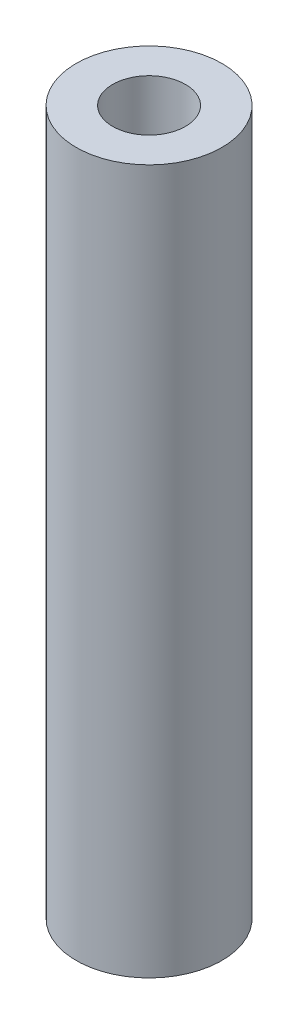
ISO-10303-21;
HEADER;
FILE_DESCRIPTION(('STEP AP214'),'2;1');
FILE_NAME('part.step','',(''),(''),'','','');
FILE_SCHEMA(('AUTOMOTIVE_DESIGN { 1 0 10303 214 1 1 1 1 }'));
ENDSEC;
DATA;
#1=APPLICATION_CONTEXT('core data for automotive mechanical design processes');
#2=APPLICATION_PROTOCOL_DEFINITION('international standard','automotive_design',2000,#1);
#3=PRODUCT_CONTEXT('',#1,'mechanical');
#4=PRODUCT('Part','Part','',(#3));
#5=PRODUCT_RELATED_PRODUCT_CATEGORY('part','',(#4));
#6=PRODUCT_DEFINITION_FORMATION('','',#4);
#7=PRODUCT_DEFINITION_CONTEXT('part definition',#1,'design');
#8=PRODUCT_DEFINITION('design','',#6,#7);
#9=PRODUCT_DEFINITION_SHAPE('','',#8);
#10=(LENGTH_UNIT() NAMED_UNIT(*) SI_UNIT(.MILLI.,.METRE.));
#11=(NAMED_UNIT(*) PLANE_ANGLE_UNIT() SI_UNIT($,.RADIAN.));
#12=(NAMED_UNIT(*) SI_UNIT($,.STERADIAN.) SOLID_ANGLE_UNIT());
#13=UNCERTAINTY_MEASURE_WITH_UNIT(LENGTH_MEASURE(1.E-05),#10,'distance_accuracy_value','');
#14=(GEOMETRIC_REPRESENTATION_CONTEXT(3) GLOBAL_UNCERTAINTY_ASSIGNED_CONTEXT((#13)) GLOBAL_UNIT_ASSIGNED_CONTEXT((#10,
#11,#12)) REPRESENTATION_CONTEXT('',''));
#15=CARTESIAN_POINT('',(0.,0.,0.));
#16=DIRECTION('',(0.,0.,1.));
#17=DIRECTION('',(1.,0.,0.));
#18=AXIS2_PLACEMENT_3D('',#15,#16,#17);
#19=CARTESIAN_POINT('',(0.,29.,0.));
#20=DIRECTION('',(0.,1.,0.));
#21=DIRECTION('',(0.,0.,1.));
#22=AXIS2_PLACEMENT_3D('',#19,#20,#21);
#23=PLANE('',#22);
#24=CARTESIAN_POINT('',(0.,29.,0.));
#25=DIRECTION('',(0.,1.,0.));
#26=DIRECTION('',(0.,0.,1.));
#27=AXIS2_PLACEMENT_3D('',#24,#25,#26);
#28=CIRCLE('',#27,3.);
#29=CARTESIAN_POINT('',(0.,29.,-3.));
#30=VERTEX_POINT('',#29);
#31=EDGE_CURVE('E10',#30,#30,#28,.T.);
#32=ORIENTED_EDGE('',*,*,#31,.T.);
#33=EDGE_LOOP('',(#32));
#34=FACE_BOUND('',#33,.T.);
#35=CARTESIAN_POINT('',(0.,29.,0.));
#36=DIRECTION('',(0.,1.,0.));
#37=DIRECTION('',(0.,0.,1.));
#38=AXIS2_PLACEMENT_3D('',#35,#36,#37);
#39=CIRCLE('',#38,1.5);
#40=CARTESIAN_POINT('',(0.,29.,-1.5));
#41=VERTEX_POINT('',#40);
#42=EDGE_CURVE('E42',#41,#41,#39,.T.);
#43=ORIENTED_EDGE('',*,*,#42,.F.);
#44=EDGE_LOOP('',(#43));
#45=FACE_BOUND('',#44,.T.);
#46=ADVANCED_FACE('F31',(#34,#45),#23,.T.);
#47=CARTESIAN_POINT('',(0.,0.,0.));
#48=DIRECTION('',(0.,1.,0.));
#49=DIRECTION('',(0.,0.,1.));
#50=AXIS2_PLACEMENT_3D('',#47,#48,#49);
#51=PLANE('',#50);
#52=CARTESIAN_POINT('',(0.,0.,0.));
#53=DIRECTION('',(0.,1.,0.));
#54=DIRECTION('',(0.,0.,1.));
#55=AXIS2_PLACEMENT_3D('',#52,#53,#54);
#56=CIRCLE('',#55,3.);
#57=CARTESIAN_POINT('',(0.,0.,-3.));
#58=VERTEX_POINT('',#57);
#59=EDGE_CURVE('E35',#58,#58,#56,.T.);
#60=ORIENTED_EDGE('',*,*,#59,.F.);
#61=EDGE_LOOP('',(#60));
#62=FACE_BOUND('',#61,.T.);
#63=CARTESIAN_POINT('',(0.,0.,0.));
#64=DIRECTION('',(0.,1.,0.));
#65=DIRECTION('',(0.,0.,1.));
#66=AXIS2_PLACEMENT_3D('',#63,#64,#65);
#67=CIRCLE('',#66,1.5);
#68=CARTESIAN_POINT('',(0.,0.,-1.5));
#69=VERTEX_POINT('',#68);
#70=EDGE_CURVE('E44',#69,#69,#67,.T.);
#71=ORIENTED_EDGE('',*,*,#70,.T.);
#72=EDGE_LOOP('',(#71));
#73=FACE_BOUND('',#72,.T.);
#74=ADVANCED_FACE('F54',(#62,#73),#51,.F.);
#75=CARTESIAN_POINT('',(0.,29.,0.));
#76=DIRECTION('',(0.,-1.,0.));
#77=DIRECTION('',(0.,0.,-1.));
#78=AXIS2_PLACEMENT_3D('',#75,#76,#77);
#79=CYLINDRICAL_SURFACE('',#78,3.);
#80=CARTESIAN_POINT('',(0.,29.,-3.));
#81=CARTESIAN_POINT('',(0.,28.6979166666667,-3.));
#82=CARTESIAN_POINT('',(0.,28.3958333333333,-3.));
#83=CARTESIAN_POINT('',(0.,27.7916666666667,-3.));
#84=CARTESIAN_POINT('',(0.,27.4895833333333,-3.));
#85=CARTESIAN_POINT('',(0.,26.8854166666667,-3.));
#86=CARTESIAN_POINT('',(0.,26.5833333333333,-3.));
#87=CARTESIAN_POINT('',(0.,25.9791666666667,-3.));
#88=CARTESIAN_POINT('',(0.,25.6770833333333,-3.));
#89=CARTESIAN_POINT('',(0.,25.0729166666667,-3.));
#90=CARTESIAN_POINT('',(0.,24.7708333333333,-3.));
#91=CARTESIAN_POINT('',(0.,24.1666666666667,-3.));
#92=CARTESIAN_POINT('',(0.,23.8645833333333,-3.));
#93=CARTESIAN_POINT('',(0.,23.2604166666667,-3.));
#94=CARTESIAN_POINT('',(0.,22.9583333333333,-3.));
#95=CARTESIAN_POINT('',(0.,22.3541666666667,-3.));
#96=CARTESIAN_POINT('',(0.,22.0520833333333,-3.));
#97=CARTESIAN_POINT('',(0.,21.4479166666667,-3.));
#98=CARTESIAN_POINT('',(0.,21.1458333333333,-3.));
#99=CARTESIAN_POINT('',(0.,20.5416666666667,-3.));
#100=CARTESIAN_POINT('',(0.,20.2395833333333,-3.));
#101=CARTESIAN_POINT('',(0.,19.6354166666667,-3.));
#102=CARTESIAN_POINT('',(0.,19.3333333333333,-3.));
#103=CARTESIAN_POINT('',(0.,18.7291666666667,-3.));
#104=CARTESIAN_POINT('',(0.,18.4270833333333,-3.));
#105=CARTESIAN_POINT('',(0.,17.8229166666667,-3.));
#106=CARTESIAN_POINT('',(0.,17.5208333333333,-3.));
#107=CARTESIAN_POINT('',(0.,16.9166666666667,-3.));
#108=CARTESIAN_POINT('',(0.,16.6145833333333,-3.));
#109=CARTESIAN_POINT('',(0.,16.0104166666667,-3.));
#110=CARTESIAN_POINT('',(0.,15.7083333333333,-3.));
#111=CARTESIAN_POINT('',(0.,15.1041666666667,-3.));
#112=CARTESIAN_POINT('',(0.,14.8020833333333,-3.));
#113=CARTESIAN_POINT('',(0.,14.1979166666667,-3.));
#114=CARTESIAN_POINT('',(0.,13.8958333333333,-3.));
#115=CARTESIAN_POINT('',(0.,13.2916666666667,-3.));
#116=CARTESIAN_POINT('',(0.,12.9895833333333,-3.));
#117=CARTESIAN_POINT('',(0.,12.3854166666667,-3.));
#118=CARTESIAN_POINT('',(0.,12.0833333333333,-3.));
#119=CARTESIAN_POINT('',(0.,11.4791666666667,-3.));
#120=CARTESIAN_POINT('',(0.,11.1770833333333,-3.));
#121=CARTESIAN_POINT('',(0.,10.5729166666667,-3.));
#122=CARTESIAN_POINT('',(0.,10.2708333333333,-3.));
#123=CARTESIAN_POINT('',(0.,9.66666666666667,-3.));
#124=CARTESIAN_POINT('',(0.,9.36458333333333,-3.));
#125=CARTESIAN_POINT('',(0.,8.76041666666667,-3.));
#126=CARTESIAN_POINT('',(0.,8.45833333333333,-3.));
#127=CARTESIAN_POINT('',(0.,7.85416666666667,-3.));
#128=CARTESIAN_POINT('',(0.,7.55208333333333,-3.));
#129=CARTESIAN_POINT('',(0.,6.94791666666667,-3.));
#130=CARTESIAN_POINT('',(0.,6.64583333333333,-3.));
#131=CARTESIAN_POINT('',(0.,6.04166666666667,-3.));
#132=CARTESIAN_POINT('',(0.,5.73958333333333,-3.));
#133=CARTESIAN_POINT('',(0.,5.13541666666667,-3.));
#134=CARTESIAN_POINT('',(0.,4.83333333333333,-3.));
#135=CARTESIAN_POINT('',(0.,4.22916666666667,-3.));
#136=CARTESIAN_POINT('',(0.,3.92708333333333,-3.));
#137=CARTESIAN_POINT('',(0.,3.32291666666667,-3.));
#138=CARTESIAN_POINT('',(0.,3.02083333333333,-3.));
#139=CARTESIAN_POINT('',(0.,2.41666666666667,-3.));
#140=CARTESIAN_POINT('',(0.,2.11458333333333,-3.));
#141=CARTESIAN_POINT('',(0.,1.51041666666667,-3.));
#142=CARTESIAN_POINT('',(0.,1.20833333333333,-3.));
#143=CARTESIAN_POINT('',(0.,0.604166666666667,-3.));
#144=CARTESIAN_POINT('',(0.,0.302083333333333,-3.));
#145=CARTESIAN_POINT('',(0.,0.,-3.));
#146=B_SPLINE_CURVE_WITH_KNOTS('',3,(#80,#81,#82,#83,#84,#85,#86,#87,#88,#89,#90,#91,#92,#93,
#94,#95,#96,#97,#98,#99,#100,#101,#102,#103,#104,#105,#106,#107,#108,#109,#110,#111,#112,#113,
#114,#115,#116,#117,#118,#119,#120,#121,#122,#123,#124,#125,#126,#127,#128,#129,#130,#131,#132,
#133,#134,#135,#136,#137,#138,#139,#140,#141,#142,#143,#144,#145),.UNSPECIFIED.,.F.,.F.,(4,2,2,
2,2,2,2,2,2,2,2,2,2,2,2,2,2,2,2,2,2,2,2,2,2,2,2,2,2,2,2,2,4),(0.,0.906249999999997,1.8125,
2.71875,3.625,4.53125,5.4375,6.34375,7.25,8.15625,9.0625,9.96875,10.875,11.78125,12.6875,
13.59375,14.5,15.40625,16.3125,17.21875,18.125,19.03125,19.9375,20.84375,21.75,22.65625,23.5625,
24.46875,25.375,26.28125,27.1875,28.09375,29.),.UNSPECIFIED.);
#147=EDGE_CURVE('BSEAM33',#30,#58,#146,.T.);
#148=ORIENTED_EDGE('',*,*,#31,.F.);
#149=ORIENTED_EDGE('',*,*,#59,.T.);
#150=ORIENTED_EDGE('',*,*,#147,.T.);
#151=ORIENTED_EDGE('',*,*,#147,.F.);
#152=EDGE_LOOP('',(#148,#150,#149,#151));
#153=FACE_BOUND('',#152,.T.);
#154=ADVANCED_FACE('F33',(#153),#79,.T.);
#155=CARTESIAN_POINT('',(0.,29.,0.));
#156=DIRECTION('',(0.,-1.,0.));
#157=DIRECTION('',(0.,0.,-1.));
#158=AXIS2_PLACEMENT_3D('',#155,#156,#157);
#159=CYLINDRICAL_SURFACE('',#158,1.5);
#160=CARTESIAN_POINT('',(0.,29.,-1.5));
#161=CARTESIAN_POINT('',(0.,28.6979166666667,-1.5));
#162=CARTESIAN_POINT('',(0.,28.3958333333333,-1.5));
#163=CARTESIAN_POINT('',(0.,27.7916666666667,-1.5));
#164=CARTESIAN_POINT('',(0.,27.4895833333333,-1.5));
#165=CARTESIAN_POINT('',(0.,26.8854166666667,-1.5));
#166=CARTESIAN_POINT('',(0.,26.5833333333333,-1.5));
#167=CARTESIAN_POINT('',(0.,25.9791666666667,-1.5));
#168=CARTESIAN_POINT('',(0.,25.6770833333333,-1.5));
#169=CARTESIAN_POINT('',(0.,25.0729166666667,-1.5));
#170=CARTESIAN_POINT('',(0.,24.7708333333333,-1.5));
#171=CARTESIAN_POINT('',(0.,24.1666666666667,-1.5));
#172=CARTESIAN_POINT('',(0.,23.8645833333333,-1.5));
#173=CARTESIAN_POINT('',(0.,23.2604166666667,-1.5));
#174=CARTESIAN_POINT('',(0.,22.9583333333333,-1.5));
#175=CARTESIAN_POINT('',(0.,22.3541666666667,-1.5));
#176=CARTESIAN_POINT('',(0.,22.0520833333333,-1.5));
#177=CARTESIAN_POINT('',(0.,21.4479166666667,-1.5));
#178=CARTESIAN_POINT('',(0.,21.1458333333333,-1.5));
#179=CARTESIAN_POINT('',(0.,20.5416666666667,-1.5));
#180=CARTESIAN_POINT('',(0.,20.2395833333333,-1.5));
#181=CARTESIAN_POINT('',(0.,19.6354166666667,-1.5));
#182=CARTESIAN_POINT('',(0.,19.3333333333333,-1.5));
#183=CARTESIAN_POINT('',(0.,18.7291666666667,-1.5));
#184=CARTESIAN_POINT('',(0.,18.4270833333333,-1.5));
#185=CARTESIAN_POINT('',(0.,17.8229166666667,-1.5));
#186=CARTESIAN_POINT('',(0.,17.5208333333333,-1.5));
#187=CARTESIAN_POINT('',(0.,16.9166666666667,-1.5));
#188=CARTESIAN_POINT('',(0.,16.6145833333333,-1.5));
#189=CARTESIAN_POINT('',(0.,16.0104166666667,-1.5));
#190=CARTESIAN_POINT('',(0.,15.7083333333333,-1.5));
#191=CARTESIAN_POINT('',(0.,15.1041666666667,-1.5));
#192=CARTESIAN_POINT('',(0.,14.8020833333333,-1.5));
#193=CARTESIAN_POINT('',(0.,14.1979166666667,-1.5));
#194=CARTESIAN_POINT('',(0.,13.8958333333333,-1.5));
#195=CARTESIAN_POINT('',(0.,13.2916666666667,-1.5));
#196=CARTESIAN_POINT('',(0.,12.9895833333333,-1.5));
#197=CARTESIAN_POINT('',(0.,12.3854166666667,-1.5));
#198=CARTESIAN_POINT('',(0.,12.0833333333333,-1.5));
#199=CARTESIAN_POINT('',(0.,11.4791666666667,-1.5));
#200=CARTESIAN_POINT('',(0.,11.1770833333333,-1.5));
#201=CARTESIAN_POINT('',(0.,10.5729166666667,-1.5));
#202=CARTESIAN_POINT('',(0.,10.2708333333333,-1.5));
#203=CARTESIAN_POINT('',(0.,9.66666666666667,-1.5));
#204=CARTESIAN_POINT('',(0.,9.36458333333333,-1.5));
#205=CARTESIAN_POINT('',(0.,8.76041666666667,-1.5));
#206=CARTESIAN_POINT('',(0.,8.45833333333333,-1.5));
#207=CARTESIAN_POINT('',(0.,7.85416666666667,-1.5));
#208=CARTESIAN_POINT('',(0.,7.55208333333333,-1.5));
#209=CARTESIAN_POINT('',(0.,6.94791666666667,-1.5));
#210=CARTESIAN_POINT('',(0.,6.64583333333333,-1.5));
#211=CARTESIAN_POINT('',(0.,6.04166666666667,-1.5));
#212=CARTESIAN_POINT('',(0.,5.73958333333333,-1.5));
#213=CARTESIAN_POINT('',(0.,5.13541666666667,-1.5));
#214=CARTESIAN_POINT('',(0.,4.83333333333333,-1.5));
#215=CARTESIAN_POINT('',(0.,4.22916666666667,-1.5));
#216=CARTESIAN_POINT('',(0.,3.92708333333333,-1.5));
#217=CARTESIAN_POINT('',(0.,3.32291666666667,-1.5));
#218=CARTESIAN_POINT('',(0.,3.02083333333333,-1.5));
#219=CARTESIAN_POINT('',(0.,2.41666666666667,-1.5));
#220=CARTESIAN_POINT('',(0.,2.11458333333333,-1.5));
#221=CARTESIAN_POINT('',(0.,1.51041666666667,-1.5));
#222=CARTESIAN_POINT('',(0.,1.20833333333333,-1.5));
#223=CARTESIAN_POINT('',(0.,0.604166666666667,-1.5));
#224=CARTESIAN_POINT('',(0.,0.302083333333333,-1.5));
#225=CARTESIAN_POINT('',(0.,0.,-1.5));
#226=B_SPLINE_CURVE_WITH_KNOTS('',3,(#160,#161,#162,#163,#164,#165,#166,#167,#168,#169,#170,
#171,#172,#173,#174,#175,#176,#177,#178,#179,#180,#181,#182,#183,#184,#185,#186,#187,#188,#189,
#190,#191,#192,#193,#194,#195,#196,#197,#198,#199,#200,#201,#202,#203,#204,#205,#206,#207,#208,
#209,#210,#211,#212,#213,#214,#215,#216,#217,#218,#219,#220,#221,#222,#223,#224,#225),
.UNSPECIFIED.,.F.,.F.,(4,2,2,2,2,2,2,2,2,2,2,2,2,2,2,2,2,2,2,2,2,2,2,2,2,2,2,2,2,2,2,2,4),(0.,
0.906250000000001,1.8125,2.71875,3.625,4.53125,5.4375,6.34375,7.25,8.15625,9.0625,9.96875,
10.875,11.78125,12.6875,13.59375,14.5,15.40625,16.3125,17.21875,18.125,19.03125,19.9375,
20.84375,21.75,22.65625,23.5625,24.46875,25.375,26.28125,27.1875,28.09375,29.),.UNSPECIFIED.);
#227=EDGE_CURVE('BSEAM50',#41,#69,#226,.T.);
#228=ORIENTED_EDGE('',*,*,#42,.T.);
#229=ORIENTED_EDGE('',*,*,#70,.F.);
#230=ORIENTED_EDGE('',*,*,#227,.T.);
#231=ORIENTED_EDGE('',*,*,#227,.F.);
#232=EDGE_LOOP('',(#228,#230,#229,#231));
#233=FACE_BOUND('',#232,.T.);
#234=ADVANCED_FACE('F50',(#233),#159,.F.);
#235=CLOSED_SHELL('',(#46,#74,#154,#234));
#236=MANIFOLD_SOLID_BREP('B2',#235);
#237=ADVANCED_BREP_SHAPE_REPRESENTATION('',(#18,#236),#14);
#238=SHAPE_DEFINITION_REPRESENTATION(#9,#237);
ENDSEC;
END-ISO-10303-21;
